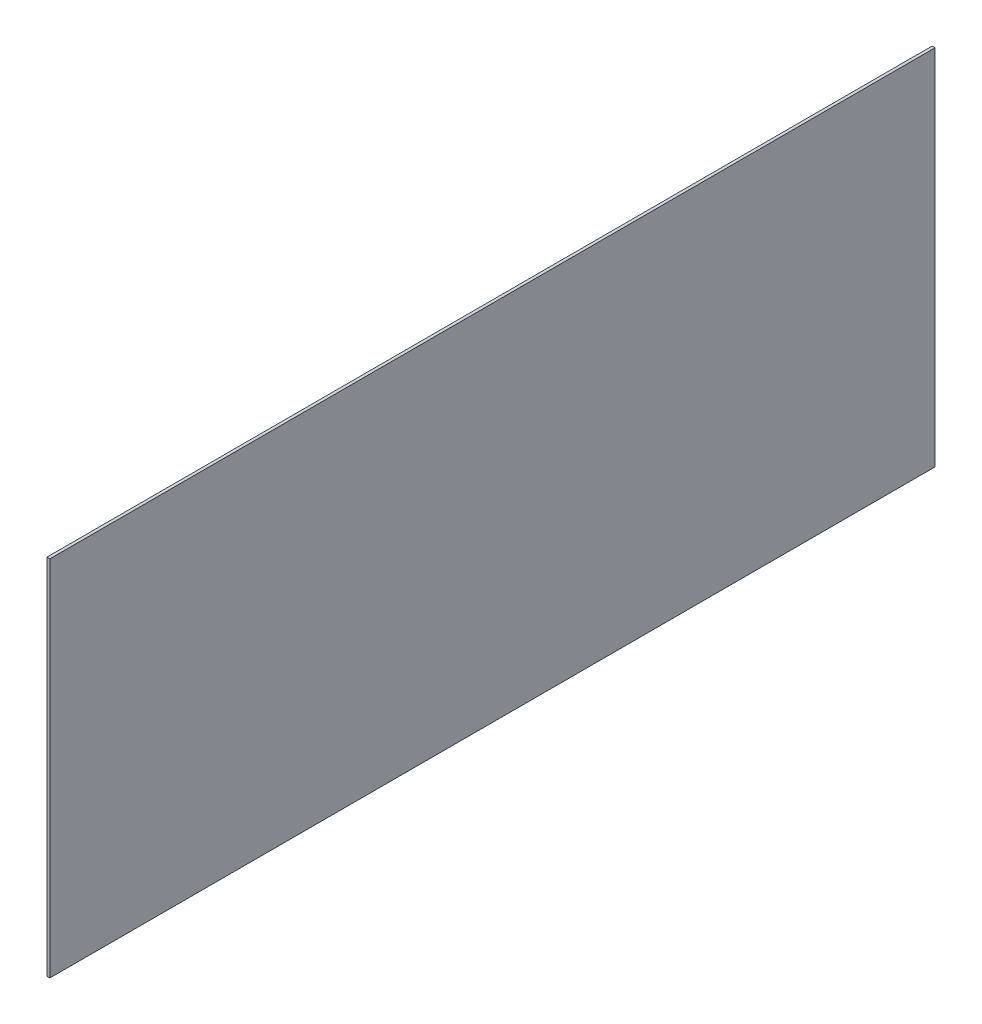
ISO-10303-21;
HEADER;
FILE_DESCRIPTION(('STEP AP214'),'2;1');
FILE_NAME('part.step','',(''),(''),'','','');
FILE_SCHEMA(('AUTOMOTIVE_DESIGN { 1 0 10303 214 1 1 1 1 }'));
ENDSEC;
DATA;
#1=APPLICATION_CONTEXT('core data for automotive mechanical design processes');
#2=APPLICATION_PROTOCOL_DEFINITION('international standard','automotive_design',2000,#1);
#3=PRODUCT_CONTEXT('',#1,'mechanical');
#4=PRODUCT('Part','Part','',(#3));
#5=PRODUCT_RELATED_PRODUCT_CATEGORY('part','',(#4));
#6=PRODUCT_DEFINITION_FORMATION('','',#4);
#7=PRODUCT_DEFINITION_CONTEXT('part definition',#1,'design');
#8=PRODUCT_DEFINITION('design','',#6,#7);
#9=PRODUCT_DEFINITION_SHAPE('','',#8);
#10=(LENGTH_UNIT() NAMED_UNIT(*) SI_UNIT(.MILLI.,.METRE.));
#11=(NAMED_UNIT(*) PLANE_ANGLE_UNIT() SI_UNIT($,.RADIAN.));
#12=(NAMED_UNIT(*) SI_UNIT($,.STERADIAN.) SOLID_ANGLE_UNIT());
#13=UNCERTAINTY_MEASURE_WITH_UNIT(LENGTH_MEASURE(1.E-05),#10,'distance_accuracy_value','');
#14=(GEOMETRIC_REPRESENTATION_CONTEXT(3) GLOBAL_UNCERTAINTY_ASSIGNED_CONTEXT((#13)) GLOBAL_UNIT_ASSIGNED_CONTEXT((#10,
#11,#12)) REPRESENTATION_CONTEXT('',''));
#15=CARTESIAN_POINT('',(0.,0.,0.));
#16=DIRECTION('',(0.,0.,1.));
#17=DIRECTION('',(1.,0.,0.));
#18=AXIS2_PLACEMENT_3D('',#15,#16,#17);
#19=CARTESIAN_POINT('',(-126.,-60.,150.));
#20=DIRECTION('',(0.,0.,1.));
#21=DIRECTION('',(1.,0.,0.));
#22=AXIS2_PLACEMENT_3D('',#19,#20,#21);
#23=PLANE('',#22);
#24=DIRECTION('',(0.,-1.,0.));
#25=VECTOR('',#24,1.);
#26=CARTESIAN_POINT('',(-125.,-60.,150.));
#27=LINE('',#26,#25);
#28=CARTESIAN_POINT('',(-125.,63.,150.));
#29=VERTEX_POINT('',#28);
#30=CARTESIAN_POINT('',(-125.,-60.,150.));
#31=VERTEX_POINT('',#30);
#32=EDGE_CURVE('E105',#29,#31,#27,.T.);
#33=ORIENTED_EDGE('',*,*,#32,.F.);
#34=DIRECTION('',(1.,0.,0.));
#35=VECTOR('',#34,1.);
#36=CARTESIAN_POINT('',(-126.,63.,150.));
#37=LINE('',#36,#35);
#38=CARTESIAN_POINT('',(-126.,63.,150.));
#39=VERTEX_POINT('',#38);
#40=EDGE_CURVE('E11',#39,#29,#37,.T.);
#41=ORIENTED_EDGE('',*,*,#40,.F.);
#42=DIRECTION('',(0.,-1.,0.));
#43=VECTOR('',#42,1.);
#44=CARTESIAN_POINT('',(-126.,-60.,150.));
#45=LINE('',#44,#43);
#46=CARTESIAN_POINT('',(-126.,-60.,150.));
#47=VERTEX_POINT('',#46);
#48=EDGE_CURVE('E99',#39,#47,#45,.T.);
#49=ORIENTED_EDGE('',*,*,#48,.T.);
#50=DIRECTION('',(1.,0.,0.));
#51=VECTOR('',#50,1.);
#52=CARTESIAN_POINT('',(-126.,-60.,150.));
#53=LINE('',#52,#51);
#54=EDGE_CURVE('E44',#47,#31,#53,.T.);
#55=ORIENTED_EDGE('',*,*,#54,.T.);
#56=EDGE_LOOP('',(#33,#41,#49,#55));
#57=FACE_BOUND('',#56,.T.);
#58=ADVANCED_FACE('F41',(#57),#23,.T.);
#59=CARTESIAN_POINT('',(-126.,63.,150.));
#60=DIRECTION('',(0.,1.,0.));
#61=DIRECTION('',(0.,0.,1.));
#62=AXIS2_PLACEMENT_3D('',#59,#60,#61);
#63=PLANE('',#62);
#64=DIRECTION('',(0.,0.,1.));
#65=VECTOR('',#64,1.);
#66=CARTESIAN_POINT('',(-125.,63.,150.));
#67=LINE('',#66,#65);
#68=CARTESIAN_POINT('',(-125.,63.,-150.));
#69=VERTEX_POINT('',#68);
#70=EDGE_CURVE('E101',#69,#29,#67,.T.);
#71=ORIENTED_EDGE('',*,*,#70,.F.);
#72=DIRECTION('',(1.,0.,0.));
#73=VECTOR('',#72,1.);
#74=CARTESIAN_POINT('',(-126.,63.,-150.));
#75=LINE('',#74,#73);
#76=CARTESIAN_POINT('',(-126.,63.,-150.));
#77=VERTEX_POINT('',#76);
#78=EDGE_CURVE('E50',#77,#69,#75,.T.);
#79=ORIENTED_EDGE('',*,*,#78,.F.);
#80=DIRECTION('',(0.,0.,1.));
#81=VECTOR('',#80,1.);
#82=CARTESIAN_POINT('',(-126.,63.,150.));
#83=LINE('',#82,#81);
#84=EDGE_CURVE('E96',#77,#39,#83,.T.);
#85=ORIENTED_EDGE('',*,*,#84,.T.);
#86=ORIENTED_EDGE('',*,*,#40,.T.);
#87=EDGE_LOOP('',(#71,#79,#85,#86));
#88=FACE_BOUND('',#87,.T.);
#89=ADVANCED_FACE('F115',(#88),#63,.T.);
#90=CARTESIAN_POINT('',(-126.,-60.,-150.));
#91=DIRECTION('',(0.,0.,-1.));
#92=DIRECTION('',(-1.,0.,0.));
#93=AXIS2_PLACEMENT_3D('',#90,#91,#92);
#94=PLANE('',#93);
#95=DIRECTION('',(0.,1.,0.));
#96=VECTOR('',#95,1.);
#97=CARTESIAN_POINT('',(-125.,-60.,-150.));
#98=LINE('',#97,#96);
#99=CARTESIAN_POINT('',(-125.,-60.,-150.));
#100=VERTEX_POINT('',#99);
#101=EDGE_CURVE('E91',#100,#69,#98,.T.);
#102=ORIENTED_EDGE('',*,*,#101,.F.);
#103=DIRECTION('',(1.,0.,0.));
#104=VECTOR('',#103,1.);
#105=CARTESIAN_POINT('',(-126.,-60.,-150.));
#106=LINE('',#105,#104);
#107=CARTESIAN_POINT('',(-126.,-60.,-150.));
#108=VERTEX_POINT('',#107);
#109=EDGE_CURVE('E86',#108,#100,#106,.T.);
#110=ORIENTED_EDGE('',*,*,#109,.F.);
#111=DIRECTION('',(0.,1.,0.));
#112=VECTOR('',#111,1.);
#113=CARTESIAN_POINT('',(-126.,-60.,-150.));
#114=LINE('',#113,#112);
#115=EDGE_CURVE('E89',#108,#77,#114,.T.);
#116=ORIENTED_EDGE('',*,*,#115,.T.);
#117=ORIENTED_EDGE('',*,*,#78,.T.);
#118=EDGE_LOOP('',(#102,#110,#116,#117));
#119=FACE_BOUND('',#118,.T.);
#120=ADVANCED_FACE('F88',(#119),#94,.T.);
#121=CARTESIAN_POINT('',(-126.,-60.,150.));
#122=DIRECTION('',(0.,-1.,0.));
#123=DIRECTION('',(0.,0.,-1.));
#124=AXIS2_PLACEMENT_3D('',#121,#122,#123);
#125=PLANE('',#124);
#126=DIRECTION('',(0.,0.,-1.));
#127=VECTOR('',#126,1.);
#128=CARTESIAN_POINT('',(-125.,-60.,150.));
#129=LINE('',#128,#127);
#130=EDGE_CURVE('E108',#31,#100,#129,.T.);
#131=ORIENTED_EDGE('',*,*,#130,.F.);
#132=ORIENTED_EDGE('',*,*,#54,.F.);
#133=DIRECTION('',(0.,0.,-1.));
#134=VECTOR('',#133,1.);
#135=CARTESIAN_POINT('',(-126.,-60.,150.));
#136=LINE('',#135,#134);
#137=EDGE_CURVE('E95',#47,#108,#136,.T.);
#138=ORIENTED_EDGE('',*,*,#137,.T.);
#139=ORIENTED_EDGE('',*,*,#109,.T.);
#140=EDGE_LOOP('',(#131,#132,#138,#139));
#141=FACE_BOUND('',#140,.T.);
#142=ADVANCED_FACE('F98',(#141),#125,.T.);
#143=CARTESIAN_POINT('',(-126.,0.,0.));
#144=DIRECTION('',(-1.,0.,0.));
#145=DIRECTION('',(0.,0.,1.));
#146=AXIS2_PLACEMENT_3D('',#143,#144,#145);
#147=PLANE('',#146);
#148=ORIENTED_EDGE('',*,*,#48,.F.);
#149=ORIENTED_EDGE('',*,*,#84,.F.);
#150=ORIENTED_EDGE('',*,*,#115,.F.);
#151=ORIENTED_EDGE('',*,*,#137,.F.);
#152=EDGE_LOOP('',(#148,#149,#150,#151));
#153=FACE_BOUND('',#152,.T.);
#154=ADVANCED_FACE('F94',(#153),#147,.T.);
#155=CARTESIAN_POINT('',(-125.,0.,0.));
#156=DIRECTION('',(-1.,0.,0.));
#157=DIRECTION('',(0.,0.,1.));
#158=AXIS2_PLACEMENT_3D('',#155,#156,#157);
#159=PLANE('',#158);
#160=ORIENTED_EDGE('',*,*,#32,.T.);
#161=ORIENTED_EDGE('',*,*,#130,.T.);
#162=ORIENTED_EDGE('',*,*,#101,.T.);
#163=ORIENTED_EDGE('',*,*,#70,.T.);
#164=EDGE_LOOP('',(#160,#161,#162,#163));
#165=FACE_BOUND('',#164,.T.);
#166=ADVANCED_FACE('F114',(#165),#159,.F.);
#167=CLOSED_SHELL('',(#58,#89,#120,#142,#154,#166));
#168=MANIFOLD_SOLID_BREP('B2',#167);
#169=ADVANCED_BREP_SHAPE_REPRESENTATION('',(#18,#168),#14);
#170=SHAPE_DEFINITION_REPRESENTATION(#9,#169);
ENDSEC;
END-ISO-10303-21;
